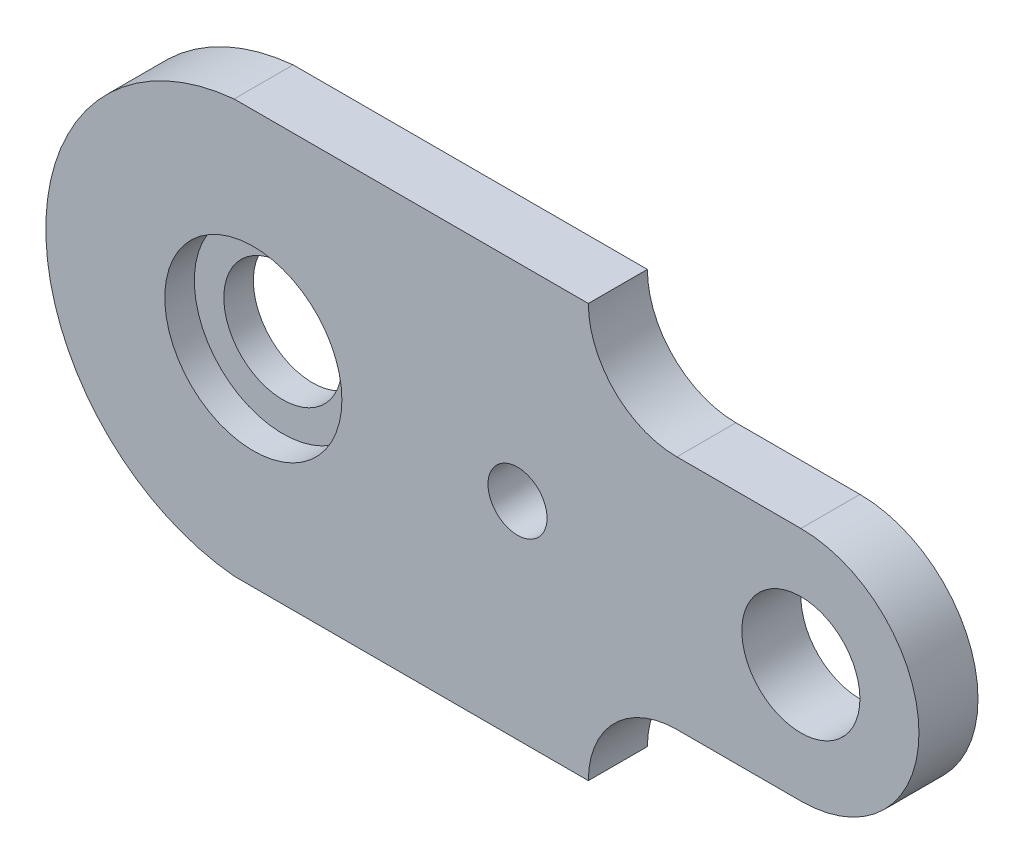
ISO-10303-21;
HEADER;
FILE_DESCRIPTION(('STEP AP214'),'2;1');
FILE_NAME('part.step','',(''),(''),'','','');
FILE_SCHEMA(('AUTOMOTIVE_DESIGN { 1 0 10303 214 1 1 1 1 }'));
ENDSEC;
DATA;
#1=APPLICATION_CONTEXT('core data for automotive mechanical design processes');
#2=APPLICATION_PROTOCOL_DEFINITION('international standard','automotive_design',2000,#1);
#3=PRODUCT_CONTEXT('',#1,'mechanical');
#4=PRODUCT('Part','Part','',(#3));
#5=PRODUCT_RELATED_PRODUCT_CATEGORY('part','',(#4));
#6=PRODUCT_DEFINITION_FORMATION('','',#4);
#7=PRODUCT_DEFINITION_CONTEXT('part definition',#1,'design');
#8=PRODUCT_DEFINITION('design','',#6,#7);
#9=PRODUCT_DEFINITION_SHAPE('','',#8);
#10=(LENGTH_UNIT() NAMED_UNIT(*) SI_UNIT(.MILLI.,.METRE.));
#11=(NAMED_UNIT(*) PLANE_ANGLE_UNIT() SI_UNIT($,.RADIAN.));
#12=(NAMED_UNIT(*) SI_UNIT($,.STERADIAN.) SOLID_ANGLE_UNIT());
#13=UNCERTAINTY_MEASURE_WITH_UNIT(LENGTH_MEASURE(1.E-05),#10,'distance_accuracy_value','');
#14=(GEOMETRIC_REPRESENTATION_CONTEXT(3) GLOBAL_UNCERTAINTY_ASSIGNED_CONTEXT((#13)) GLOBAL_UNIT_ASSIGNED_CONTEXT((#10,
#11,#12)) REPRESENTATION_CONTEXT('',''));
#15=CARTESIAN_POINT('',(0.,0.,0.));
#16=DIRECTION('',(0.,0.,1.));
#17=DIRECTION('',(1.,0.,0.));
#18=AXIS2_PLACEMENT_3D('',#15,#16,#17);
#19=CARTESIAN_POINT('',(-203.793152693395,63.4723096884409,10.));
#20=DIRECTION('',(0.,0.,-1.));
#21=DIRECTION('',(-1.,0.,0.));
#22=AXIS2_PLACEMENT_3D('',#19,#20,#21);
#23=PLANE('',#22);
#24=CARTESIAN_POINT('',(-203.793152693395,63.4723096884409,10.));
#25=DIRECTION('',(0.,0.,1.));
#26=DIRECTION('',(1.,0.,0.));
#27=AXIS2_PLACEMENT_3D('',#24,#25,#26);
#28=CIRCLE('',#27,15.);
#29=CARTESIAN_POINT('',(-188.793152693395,63.4723096884409,10.));
#30=VERTEX_POINT('',#29);
#31=EDGE_CURVE('E225',#30,#30,#28,.T.);
#32=ORIENTED_EDGE('',*,*,#31,.F.);
#33=EDGE_LOOP('',(#32));
#34=FACE_BOUND('',#33,.T.);
#35=CARTESIAN_POINT('',(-203.793152693395,63.4723096884409,10.));
#36=DIRECTION('',(0.,0.,1.));
#37=DIRECTION('',(-1.,0.,0.));
#38=AXIS2_PLACEMENT_3D('',#35,#36,#37);
#39=CIRCLE('',#38,35.1512260147666);
#40=CARTESIAN_POINT('',(-207.050381934448,98.4722975171878,10.));
#41=VERTEX_POINT('',#40);
#42=CARTESIAN_POINT('',(-207.050381934448,28.4723218596941,10.));
#43=VERTEX_POINT('',#42);
#44=EDGE_CURVE('E164',#41,#43,#39,.T.);
#45=ORIENTED_EDGE('',*,*,#44,.T.);
#46=DIRECTION('',(1.,0.,0.));
#47=VECTOR('',#46,1.);
#48=CARTESIAN_POINT('',(-207.050381934448,28.4723218596941,10.));
#49=LINE('',#48,#47);
#50=CARTESIAN_POINT('',(-147.050381934448,28.4723218596941,10.));
#51=VERTEX_POINT('',#50);
#52=EDGE_CURVE('E100',#43,#51,#49,.T.);
#53=ORIENTED_EDGE('',*,*,#52,.T.);
#54=CARTESIAN_POINT('',(-132.050406276954,28.4723218596941,10.));
#55=DIRECTION('',(0.,0.,-1.));
#56=DIRECTION('',(-1.,0.,0.));
#57=AXIS2_PLACEMENT_3D('',#54,#55,#56);
#58=CIRCLE('',#57,14.9999756574937);
#59=CARTESIAN_POINT('',(-132.050406276954,43.4722975171878,10.));
#60=VERTEX_POINT('',#59);
#61=EDGE_CURVE('E185',#51,#60,#58,.T.);
#62=ORIENTED_EDGE('',*,*,#61,.T.);
#63=DIRECTION('',(1.,0.,0.));
#64=VECTOR('',#63,1.);
#65=CARTESIAN_POINT('',(-111.050381934448,43.4722975171878,10.));
#66=LINE('',#65,#64);
#67=CARTESIAN_POINT('',(-111.050381934448,43.4722975171878,10.));
#68=VERTEX_POINT('',#67);
#69=EDGE_CURVE('E199',#60,#68,#66,.T.);
#70=ORIENTED_EDGE('',*,*,#69,.T.);
#71=CARTESIAN_POINT('',(-111.050381934448,63.4722975171878,10.));
#72=DIRECTION('',(0.,0.,1.));
#73=DIRECTION('',(-1.,0.,0.));
#74=AXIS2_PLACEMENT_3D('',#71,#72,#73);
#75=CIRCLE('',#74,20.);
#76=CARTESIAN_POINT('',(-111.050381934448,83.4722975171878,10.));
#77=VERTEX_POINT('',#76);
#78=EDGE_CURVE('E119',#68,#77,#75,.T.);
#79=ORIENTED_EDGE('',*,*,#78,.T.);
#80=DIRECTION('',(-1.,0.,0.));
#81=VECTOR('',#80,1.);
#82=CARTESIAN_POINT('',(-132.050381934448,83.4722975171878,10.));
#83=LINE('',#82,#81);
#84=CARTESIAN_POINT('',(-132.050381934448,83.4722975171878,10.));
#85=VERTEX_POINT('',#84);
#86=EDGE_CURVE('E113',#77,#85,#83,.T.);
#87=ORIENTED_EDGE('',*,*,#86,.T.);
#88=CARTESIAN_POINT('',(-132.050381934448,98.4722975171878,10.));
#89=DIRECTION('',(0.,0.,-1.));
#90=DIRECTION('',(1.,0.,0.));
#91=AXIS2_PLACEMENT_3D('',#88,#89,#90);
#92=CIRCLE('',#91,15.);
#93=CARTESIAN_POINT('',(-147.050381934448,98.4722975171878,10.));
#94=VERTEX_POINT('',#93);
#95=EDGE_CURVE('E117',#85,#94,#92,.T.);
#96=ORIENTED_EDGE('',*,*,#95,.T.);
#97=DIRECTION('',(-1.,0.,0.));
#98=VECTOR('',#97,1.);
#99=CARTESIAN_POINT('',(-207.050381934448,98.4722975171878,10.));
#100=LINE('',#99,#98);
#101=EDGE_CURVE('E57',#94,#41,#100,.T.);
#102=ORIENTED_EDGE('',*,*,#101,.T.);
#103=EDGE_LOOP('',(#45,#53,#62,#70,#79,#87,#96,#102));
#104=FACE_BOUND('',#103,.T.);
#105=CARTESIAN_POINT('',(-111.050381934448,63.4722975171878,10.));
#106=DIRECTION('',(0.,0.,1.));
#107=DIRECTION('',(1.,0.,0.));
#108=AXIS2_PLACEMENT_3D('',#105,#106,#107);
#109=CIRCLE('',#108,9.99999999999999);
#110=CARTESIAN_POINT('',(-101.050381934448,63.4722975171878,10.));
#111=VERTEX_POINT('',#110);
#112=EDGE_CURVE('E146',#111,#111,#109,.T.);
#113=ORIENTED_EDGE('',*,*,#112,.F.);
#114=EDGE_LOOP('',(#113));
#115=FACE_BOUND('',#114,.T.);
#116=CARTESIAN_POINT('',(-159.050381934448,63.4723096884409,10.));
#117=DIRECTION('',(0.,0.,1.));
#118=DIRECTION('',(1.,0.,0.));
#119=AXIS2_PLACEMENT_3D('',#116,#117,#118);
#120=CIRCLE('',#119,4.99999999999999);
#121=CARTESIAN_POINT('',(-154.050381934448,63.4723096884409,10.));
#122=VERTEX_POINT('',#121);
#123=EDGE_CURVE('E213',#122,#122,#120,.T.);
#124=ORIENTED_EDGE('',*,*,#123,.F.);
#125=EDGE_LOOP('',(#124));
#126=FACE_BOUND('',#125,.T.);
#127=ADVANCED_FACE('F39',(#34,#104,#115,#126),#23,.F.);
#128=CARTESIAN_POINT('',(-203.793152693395,63.4723096884409,0.));
#129=DIRECTION('',(0.,0.,-1.));
#130=DIRECTION('',(-1.,0.,0.));
#131=AXIS2_PLACEMENT_3D('',#128,#129,#130);
#132=PLANE('',#131);
#133=CARTESIAN_POINT('',(-203.793152693395,63.4723096884409,0.));
#134=DIRECTION('',(0.,0.,1.));
#135=DIRECTION('',(1.,0.,0.));
#136=AXIS2_PLACEMENT_3D('',#133,#134,#135);
#137=CIRCLE('',#136,10.);
#138=CARTESIAN_POINT('',(-193.793152693395,63.4723096884409,0.));
#139=VERTEX_POINT('',#138);
#140=EDGE_CURVE('E229',#139,#139,#137,.T.);
#141=ORIENTED_EDGE('',*,*,#140,.T.);
#142=EDGE_LOOP('',(#141));
#143=FACE_BOUND('',#142,.T.);
#144=CARTESIAN_POINT('',(-111.050381934448,63.4722975171878,0.));
#145=DIRECTION('',(0.,0.,1.));
#146=DIRECTION('',(1.,0.,0.));
#147=AXIS2_PLACEMENT_3D('',#144,#145,#146);
#148=CIRCLE('',#147,9.99999999999999);
#149=CARTESIAN_POINT('',(-101.050381934448,63.4722975171878,0.));
#150=VERTEX_POINT('',#149);
#151=EDGE_CURVE('E209',#150,#150,#148,.T.);
#152=ORIENTED_EDGE('',*,*,#151,.T.);
#153=EDGE_LOOP('',(#152));
#154=FACE_BOUND('',#153,.T.);
#155=CARTESIAN_POINT('',(-203.793152693395,63.4723096884409,0.));
#156=DIRECTION('',(0.,0.,1.));
#157=DIRECTION('',(-1.,0.,0.));
#158=AXIS2_PLACEMENT_3D('',#155,#156,#157);
#159=CIRCLE('',#158,35.1512260147666);
#160=CARTESIAN_POINT('',(-207.050381934448,98.4722975171878,0.));
#161=VERTEX_POINT('',#160);
#162=CARTESIAN_POINT('',(-207.050381934448,28.4723218596941,0.));
#163=VERTEX_POINT('',#162);
#164=EDGE_CURVE('E141',#161,#163,#159,.T.);
#165=ORIENTED_EDGE('',*,*,#164,.F.);
#166=DIRECTION('',(-1.,0.,0.));
#167=VECTOR('',#166,1.);
#168=CARTESIAN_POINT('',(-207.050381934448,98.4722975171878,0.));
#169=LINE('',#168,#167);
#170=CARTESIAN_POINT('',(-147.050381934448,98.4722975171878,0.));
#171=VERTEX_POINT('',#170);
#172=EDGE_CURVE('E92',#171,#161,#169,.T.);
#173=ORIENTED_EDGE('',*,*,#172,.F.);
#174=CARTESIAN_POINT('',(-132.050381934448,98.4722975171878,0.));
#175=DIRECTION('',(0.,0.,-1.));
#176=DIRECTION('',(1.,0.,0.));
#177=AXIS2_PLACEMENT_3D('',#174,#175,#176);
#178=CIRCLE('',#177,15.);
#179=CARTESIAN_POINT('',(-132.050381934448,83.4722975171878,0.));
#180=VERTEX_POINT('',#179);
#181=EDGE_CURVE('E86',#180,#171,#178,.T.);
#182=ORIENTED_EDGE('',*,*,#181,.F.);
#183=DIRECTION('',(-1.,0.,0.));
#184=VECTOR('',#183,1.);
#185=CARTESIAN_POINT('',(-132.050381934448,83.4722975171878,0.));
#186=LINE('',#185,#184);
#187=CARTESIAN_POINT('',(-111.050381934448,83.4722975171878,0.));
#188=VERTEX_POINT('',#187);
#189=EDGE_CURVE('E128',#188,#180,#186,.T.);
#190=ORIENTED_EDGE('',*,*,#189,.F.);
#191=CARTESIAN_POINT('',(-111.050381934448,63.4722975171878,0.));
#192=DIRECTION('',(0.,0.,1.));
#193=DIRECTION('',(-1.,0.,0.));
#194=AXIS2_PLACEMENT_3D('',#191,#192,#193);
#195=CIRCLE('',#194,20.);
#196=CARTESIAN_POINT('',(-111.050381934448,43.4722975171878,0.));
#197=VERTEX_POINT('',#196);
#198=EDGE_CURVE('E155',#197,#188,#195,.T.);
#199=ORIENTED_EDGE('',*,*,#198,.F.);
#200=DIRECTION('',(1.,0.,0.));
#201=VECTOR('',#200,1.);
#202=CARTESIAN_POINT('',(-111.050381934448,43.4722975171878,0.));
#203=LINE('',#202,#201);
#204=CARTESIAN_POINT('',(-132.050406276954,43.4722975171878,0.));
#205=VERTEX_POINT('',#204);
#206=EDGE_CURVE('E152',#205,#197,#203,.T.);
#207=ORIENTED_EDGE('',*,*,#206,.F.);
#208=CARTESIAN_POINT('',(-132.050406276954,28.4723218596941,0.));
#209=DIRECTION('',(0.,0.,-1.));
#210=DIRECTION('',(-1.,0.,0.));
#211=AXIS2_PLACEMENT_3D('',#208,#209,#210);
#212=CIRCLE('',#211,14.9999756574937);
#213=CARTESIAN_POINT('',(-147.050381934448,28.4723218596941,0.));
#214=VERTEX_POINT('',#213);
#215=EDGE_CURVE('E149',#214,#205,#212,.T.);
#216=ORIENTED_EDGE('',*,*,#215,.F.);
#217=DIRECTION('',(1.,0.,0.));
#218=VECTOR('',#217,1.);
#219=CARTESIAN_POINT('',(-207.050381934448,28.4723218596941,0.));
#220=LINE('',#219,#218);
#221=EDGE_CURVE('E145',#163,#214,#220,.T.);
#222=ORIENTED_EDGE('',*,*,#221,.F.);
#223=EDGE_LOOP('',(#165,#173,#182,#190,#199,#207,#216,#222));
#224=FACE_BOUND('',#223,.T.);
#225=CARTESIAN_POINT('',(-159.050381934448,63.4723096884409,0.));
#226=DIRECTION('',(0.,0.,1.));
#227=DIRECTION('',(1.,0.,0.));
#228=AXIS2_PLACEMENT_3D('',#225,#226,#227);
#229=CIRCLE('',#228,4.99999999999999);
#230=CARTESIAN_POINT('',(-154.050381934448,63.4723096884409,0.));
#231=VERTEX_POINT('',#230);
#232=EDGE_CURVE('E217',#231,#231,#229,.T.);
#233=ORIENTED_EDGE('',*,*,#232,.T.);
#234=EDGE_LOOP('',(#233));
#235=FACE_BOUND('',#234,.T.);
#236=ADVANCED_FACE('F189',(#143,#154,#224,#235),#132,.T.);
#237=CARTESIAN_POINT('',(-203.793152693395,63.4723096884409,10.));
#238=DIRECTION('',(0.,0.,-1.));
#239=DIRECTION('',(-1.,0.,0.));
#240=AXIS2_PLACEMENT_3D('',#237,#238,#239);
#241=CYLINDRICAL_SURFACE('',#240,35.1512260147666);
#242=ORIENTED_EDGE('',*,*,#164,.T.);
#243=DIRECTION('',(0.,0.,-1.));
#244=VECTOR('',#243,1.);
#245=CARTESIAN_POINT('',(-207.050381934448,28.4723218596941,10.));
#246=LINE('',#245,#244);
#247=EDGE_CURVE('E11',#43,#163,#246,.T.);
#248=ORIENTED_EDGE('',*,*,#247,.F.);
#249=ORIENTED_EDGE('',*,*,#44,.F.);
#250=DIRECTION('',(0.,0.,-1.));
#251=VECTOR('',#250,1.);
#252=CARTESIAN_POINT('',(-207.050381934448,98.4722975171878,10.));
#253=LINE('',#252,#251);
#254=EDGE_CURVE('E137',#41,#161,#253,.T.);
#255=ORIENTED_EDGE('',*,*,#254,.T.);
#256=EDGE_LOOP('',(#242,#248,#249,#255));
#257=FACE_BOUND('',#256,.T.);
#258=ADVANCED_FACE('F41',(#257),#241,.T.);
#259=CARTESIAN_POINT('',(-207.050381934448,28.4723218596941,10.));
#260=DIRECTION('',(0.,1.,0.));
#261=DIRECTION('',(-1.,0.,0.));
#262=AXIS2_PLACEMENT_3D('',#259,#260,#261);
#263=PLANE('',#262);
#264=ORIENTED_EDGE('',*,*,#221,.T.);
#265=DIRECTION('',(0.,0.,-1.));
#266=VECTOR('',#265,1.);
#267=CARTESIAN_POINT('',(-147.050381934448,28.4723218596941,10.));
#268=LINE('',#267,#266);
#269=EDGE_CURVE('E49',#51,#214,#268,.T.);
#270=ORIENTED_EDGE('',*,*,#269,.F.);
#271=ORIENTED_EDGE('',*,*,#52,.F.);
#272=ORIENTED_EDGE('',*,*,#247,.T.);
#273=EDGE_LOOP('',(#264,#270,#271,#272));
#274=FACE_BOUND('',#273,.T.);
#275=ADVANCED_FACE('F284',(#274),#263,.F.);
#276=CARTESIAN_POINT('',(-132.050406276954,28.4723218596941,10.));
#277=DIRECTION('',(0.,0.,-1.));
#278=DIRECTION('',(-1.,0.,0.));
#279=AXIS2_PLACEMENT_3D('',#276,#277,#278);
#280=CYLINDRICAL_SURFACE('',#279,14.9999756574937);
#281=ORIENTED_EDGE('',*,*,#215,.T.);
#282=DIRECTION('',(0.,0.,-1.));
#283=VECTOR('',#282,1.);
#284=CARTESIAN_POINT('',(-132.050406276954,43.4722975171878,10.));
#285=LINE('',#284,#283);
#286=EDGE_CURVE('E175',#60,#205,#285,.T.);
#287=ORIENTED_EDGE('',*,*,#286,.F.);
#288=ORIENTED_EDGE('',*,*,#61,.F.);
#289=ORIENTED_EDGE('',*,*,#269,.T.);
#290=EDGE_LOOP('',(#281,#287,#288,#289));
#291=FACE_BOUND('',#290,.T.);
#292=ADVANCED_FACE('F183',(#291),#280,.F.);
#293=CARTESIAN_POINT('',(-111.050381934448,43.4722975171878,10.));
#294=DIRECTION('',(0.,1.,0.));
#295=DIRECTION('',(-1.,0.,0.));
#296=AXIS2_PLACEMENT_3D('',#293,#294,#295);
#297=PLANE('',#296);
#298=ORIENTED_EDGE('',*,*,#206,.T.);
#299=DIRECTION('',(0.,0.,-1.));
#300=VECTOR('',#299,1.);
#301=CARTESIAN_POINT('',(-111.050381934448,43.4722975171878,10.));
#302=LINE('',#301,#300);
#303=EDGE_CURVE('E171',#68,#197,#302,.T.);
#304=ORIENTED_EDGE('',*,*,#303,.F.);
#305=ORIENTED_EDGE('',*,*,#69,.F.);
#306=ORIENTED_EDGE('',*,*,#286,.T.);
#307=EDGE_LOOP('',(#298,#304,#305,#306));
#308=FACE_BOUND('',#307,.T.);
#309=ADVANCED_FACE('F194',(#308),#297,.F.);
#310=CARTESIAN_POINT('',(-111.050381934448,63.4722975171878,10.));
#311=DIRECTION('',(0.,0.,-1.));
#312=DIRECTION('',(-1.,0.,0.));
#313=AXIS2_PLACEMENT_3D('',#310,#311,#312);
#314=CYLINDRICAL_SURFACE('',#313,20.);
#315=ORIENTED_EDGE('',*,*,#198,.T.);
#316=DIRECTION('',(0.,0.,-1.));
#317=VECTOR('',#316,1.);
#318=CARTESIAN_POINT('',(-111.050381934448,83.4722975171878,10.));
#319=LINE('',#318,#317);
#320=EDGE_CURVE('E130',#77,#188,#319,.T.);
#321=ORIENTED_EDGE('',*,*,#320,.F.);
#322=ORIENTED_EDGE('',*,*,#78,.F.);
#323=ORIENTED_EDGE('',*,*,#303,.T.);
#324=EDGE_LOOP('',(#315,#321,#322,#323));
#325=FACE_BOUND('',#324,.T.);
#326=ADVANCED_FACE('F197',(#325),#314,.T.);
#327=CARTESIAN_POINT('',(-132.050381934448,83.4722975171878,10.));
#328=DIRECTION('',(0.,-1.,0.));
#329=DIRECTION('',(1.,0.,0.));
#330=AXIS2_PLACEMENT_3D('',#327,#328,#329);
#331=PLANE('',#330);
#332=ORIENTED_EDGE('',*,*,#189,.T.);
#333=DIRECTION('',(0.,0.,-1.));
#334=VECTOR('',#333,1.);
#335=CARTESIAN_POINT('',(-132.050381934448,83.4722975171878,10.));
#336=LINE('',#335,#334);
#337=EDGE_CURVE('E125',#85,#180,#336,.T.);
#338=ORIENTED_EDGE('',*,*,#337,.F.);
#339=ORIENTED_EDGE('',*,*,#86,.F.);
#340=ORIENTED_EDGE('',*,*,#320,.T.);
#341=EDGE_LOOP('',(#332,#338,#339,#340));
#342=FACE_BOUND('',#341,.T.);
#343=ADVANCED_FACE('F126',(#342),#331,.F.);
#344=CARTESIAN_POINT('',(-132.050381934448,98.4722975171878,10.));
#345=DIRECTION('',(0.,0.,-1.));
#346=DIRECTION('',(-1.,0.,0.));
#347=AXIS2_PLACEMENT_3D('',#344,#345,#346);
#348=CYLINDRICAL_SURFACE('',#347,15.);
#349=ORIENTED_EDGE('',*,*,#181,.T.);
#350=DIRECTION('',(0.,0.,-1.));
#351=VECTOR('',#350,1.);
#352=CARTESIAN_POINT('',(-147.050381934448,98.4722975171878,10.));
#353=LINE('',#352,#351);
#354=EDGE_CURVE('E131',#94,#171,#353,.T.);
#355=ORIENTED_EDGE('',*,*,#354,.F.);
#356=ORIENTED_EDGE('',*,*,#95,.F.);
#357=ORIENTED_EDGE('',*,*,#337,.T.);
#358=EDGE_LOOP('',(#349,#355,#356,#357));
#359=FACE_BOUND('',#358,.T.);
#360=ADVANCED_FACE('F133',(#359),#348,.F.);
#361=CARTESIAN_POINT('',(-207.050381934448,98.4722975171878,10.));
#362=DIRECTION('',(0.,-1.,0.));
#363=DIRECTION('',(0.,0.,-1.));
#364=AXIS2_PLACEMENT_3D('',#361,#362,#363);
#365=PLANE('',#364);
#366=ORIENTED_EDGE('',*,*,#172,.T.);
#367=ORIENTED_EDGE('',*,*,#254,.F.);
#368=ORIENTED_EDGE('',*,*,#101,.F.);
#369=ORIENTED_EDGE('',*,*,#354,.T.);
#370=EDGE_LOOP('',(#366,#367,#368,#369));
#371=FACE_BOUND('',#370,.T.);
#372=ADVANCED_FACE('F272',(#371),#365,.F.);
#373=CARTESIAN_POINT('',(-111.050381934448,63.4722975171878,10.));
#374=DIRECTION('',(0.,0.,-1.));
#375=DIRECTION('',(-1.,0.,0.));
#376=AXIS2_PLACEMENT_3D('',#373,#374,#375);
#377=CYLINDRICAL_SURFACE('',#376,9.99999999999999);
#378=ORIENTED_EDGE('',*,*,#112,.T.);
#379=EDGE_LOOP('',(#378));
#380=FACE_BOUND('',#379,.T.);
#381=ORIENTED_EDGE('',*,*,#151,.F.);
#382=EDGE_LOOP('',(#381));
#383=FACE_BOUND('',#382,.T.);
#384=ADVANCED_FACE('F269',(#380,#383),#377,.F.);
#385=CARTESIAN_POINT('',(-159.050381934448,63.4723096884409,10.));
#386=DIRECTION('',(0.,0.,-1.));
#387=DIRECTION('',(-1.,0.,0.));
#388=AXIS2_PLACEMENT_3D('',#385,#386,#387);
#389=CYLINDRICAL_SURFACE('',#388,4.99999999999999);
#390=ORIENTED_EDGE('',*,*,#123,.T.);
#391=EDGE_LOOP('',(#390));
#392=FACE_BOUND('',#391,.T.);
#393=ORIENTED_EDGE('',*,*,#232,.F.);
#394=EDGE_LOOP('',(#393));
#395=FACE_BOUND('',#394,.T.);
#396=ADVANCED_FACE('F258',(#392,#395),#389,.F.);
#397=CARTESIAN_POINT('',(-203.793152693395,63.4723096884409,5.));
#398=DIRECTION('',(0.,0.,1.));
#399=DIRECTION('',(1.,0.,0.));
#400=AXIS2_PLACEMENT_3D('',#397,#398,#399);
#401=CYLINDRICAL_SURFACE('',#400,15.);
#402=CARTESIAN_POINT('',(-203.793152693395,63.4723096884409,5.));
#403=DIRECTION('',(0.,0.,1.));
#404=DIRECTION('',(1.,0.,0.));
#405=AXIS2_PLACEMENT_3D('',#402,#403,#404);
#406=CIRCLE('',#405,15.);
#407=CARTESIAN_POINT('',(-188.793152693395,63.4723096884409,5.));
#408=VERTEX_POINT('',#407);
#409=EDGE_CURVE('E221',#408,#408,#406,.T.);
#410=ORIENTED_EDGE('',*,*,#409,.F.);
#411=EDGE_LOOP('',(#410));
#412=FACE_BOUND('',#411,.T.);
#413=ORIENTED_EDGE('',*,*,#31,.T.);
#414=EDGE_LOOP('',(#413));
#415=FACE_BOUND('',#414,.T.);
#416=ADVANCED_FACE('F252',(#412,#415),#401,.F.);
#417=CARTESIAN_POINT('',(-203.793152693395,63.4723096884409,5.));
#418=DIRECTION('',(0.,0.,1.));
#419=DIRECTION('',(1.,0.,0.));
#420=AXIS2_PLACEMENT_3D('',#417,#418,#419);
#421=PLANE('',#420);
#422=CARTESIAN_POINT('',(-203.793152693395,63.4723096884409,5.));
#423=DIRECTION('',(0.,0.,1.));
#424=DIRECTION('',(1.,0.,0.));
#425=AXIS2_PLACEMENT_3D('',#422,#423,#424);
#426=CIRCLE('',#425,10.);
#427=CARTESIAN_POINT('',(-193.793152693395,63.4723096884409,5.));
#428=VERTEX_POINT('',#427);
#429=EDGE_CURVE('E233',#428,#428,#426,.T.);
#430=ORIENTED_EDGE('',*,*,#429,.F.);
#431=EDGE_LOOP('',(#430));
#432=FACE_BOUND('',#431,.T.);
#433=ORIENTED_EDGE('',*,*,#409,.T.);
#434=EDGE_LOOP('',(#433));
#435=FACE_BOUND('',#434,.T.);
#436=ADVANCED_FACE('F246',(#432,#435),#421,.T.);
#437=CARTESIAN_POINT('',(-203.793152693395,63.4723096884409,0.));
#438=DIRECTION('',(0.,0.,1.));
#439=DIRECTION('',(1.,0.,0.));
#440=AXIS2_PLACEMENT_3D('',#437,#438,#439);
#441=CYLINDRICAL_SURFACE('',#440,10.);
#442=ORIENTED_EDGE('',*,*,#140,.F.);
#443=EDGE_LOOP('',(#442));
#444=FACE_BOUND('',#443,.T.);
#445=ORIENTED_EDGE('',*,*,#429,.T.);
#446=EDGE_LOOP('',(#445));
#447=FACE_BOUND('',#446,.T.);
#448=ADVANCED_FACE('F243',(#444,#447),#441,.F.);
#449=CLOSED_SHELL('',(#127,#236,#258,#275,#292,#309,#326,#343,#360,#372,#384,#396,#416,#436,#448));
#450=MANIFOLD_SOLID_BREP('B2',#449);
#451=ADVANCED_BREP_SHAPE_REPRESENTATION('',(#18,#450),#14);
#452=SHAPE_DEFINITION_REPRESENTATION(#9,#451);
ENDSEC;
END-ISO-10303-21;
